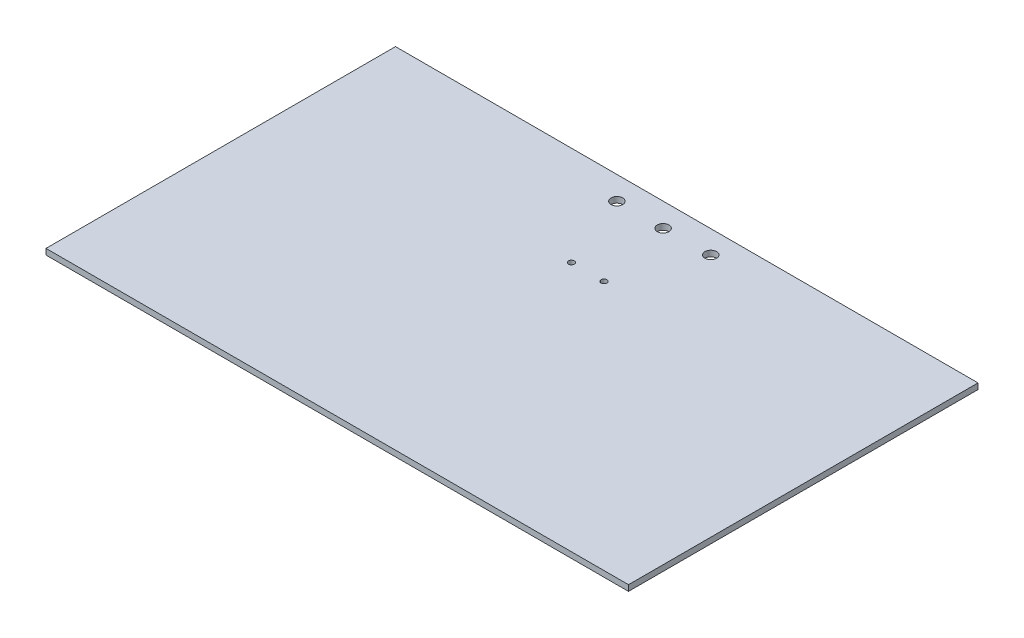
ISO-10303-21;
HEADER;
FILE_DESCRIPTION(('STEP AP214'),'2;1');
FILE_NAME('part.step','',(''),(''),'','','');
FILE_SCHEMA(('AUTOMOTIVE_DESIGN { 1 0 10303 214 1 1 1 1 }'));
ENDSEC;
DATA;
#1=APPLICATION_CONTEXT('core data for automotive mechanical design processes');
#2=APPLICATION_PROTOCOL_DEFINITION('international standard','automotive_design',2000,#1);
#3=PRODUCT_CONTEXT('',#1,'mechanical');
#4=PRODUCT('Part','Part','',(#3));
#5=PRODUCT_RELATED_PRODUCT_CATEGORY('part','',(#4));
#6=PRODUCT_DEFINITION_FORMATION('','',#4);
#7=PRODUCT_DEFINITION_CONTEXT('part definition',#1,'design');
#8=PRODUCT_DEFINITION('design','',#6,#7);
#9=PRODUCT_DEFINITION_SHAPE('','',#8);
#10=(LENGTH_UNIT() NAMED_UNIT(*) SI_UNIT(.MILLI.,.METRE.));
#11=(NAMED_UNIT(*) PLANE_ANGLE_UNIT() SI_UNIT($,.RADIAN.));
#12=(NAMED_UNIT(*) SI_UNIT($,.STERADIAN.) SOLID_ANGLE_UNIT());
#13=UNCERTAINTY_MEASURE_WITH_UNIT(LENGTH_MEASURE(1.E-05),#10,'distance_accuracy_value','');
#14=(GEOMETRIC_REPRESENTATION_CONTEXT(3) GLOBAL_UNCERTAINTY_ASSIGNED_CONTEXT((#13)) GLOBAL_UNIT_ASSIGNED_CONTEXT((#10,
#11,#12)) REPRESENTATION_CONTEXT('',''));
#15=CARTESIAN_POINT('',(0.,0.,0.));
#16=DIRECTION('',(0.,0.,1.));
#17=DIRECTION('',(1.,0.,0.));
#18=AXIS2_PLACEMENT_3D('',#15,#16,#17);
#19=CARTESIAN_POINT('',(250.,5.,-150.));
#20=DIRECTION('',(-1.,0.,0.));
#21=DIRECTION('',(0.,0.,1.));
#22=AXIS2_PLACEMENT_3D('',#19,#20,#21);
#23=PLANE('',#22);
#24=DIRECTION('',(0.,0.,-1.));
#25=VECTOR('',#24,1.);
#26=CARTESIAN_POINT('',(250.,0.,-150.));
#27=LINE('',#26,#25);
#28=CARTESIAN_POINT('',(250.,0.,150.));
#29=VERTEX_POINT('',#28);
#30=CARTESIAN_POINT('',(250.,0.,-150.));
#31=VERTEX_POINT('',#30);
#32=EDGE_CURVE('E99',#29,#31,#27,.T.);
#33=ORIENTED_EDGE('',*,*,#32,.T.);
#34=DIRECTION('',(0.,-1.,0.));
#35=VECTOR('',#34,1.);
#36=CARTESIAN_POINT('',(250.,5.,-150.));
#37=LINE('',#36,#35);
#38=CARTESIAN_POINT('',(250.,5.,-150.));
#39=VERTEX_POINT('',#38);
#40=EDGE_CURVE('E11',#39,#31,#37,.T.);
#41=ORIENTED_EDGE('',*,*,#40,.F.);
#42=DIRECTION('',(0.,0.,-1.));
#43=VECTOR('',#42,1.);
#44=CARTESIAN_POINT('',(250.,5.,-150.));
#45=LINE('',#44,#43);
#46=CARTESIAN_POINT('',(250.,5.,150.));
#47=VERTEX_POINT('',#46);
#48=EDGE_CURVE('E86',#47,#39,#45,.T.);
#49=ORIENTED_EDGE('',*,*,#48,.F.);
#50=DIRECTION('',(0.,-1.,0.));
#51=VECTOR('',#50,1.);
#52=CARTESIAN_POINT('',(250.,5.,150.));
#53=LINE('',#52,#51);
#54=EDGE_CURVE('E95',#47,#29,#53,.T.);
#55=ORIENTED_EDGE('',*,*,#54,.T.);
#56=EDGE_LOOP('',(#33,#41,#49,#55));
#57=FACE_BOUND('',#56,.T.);
#58=ADVANCED_FACE('F33',(#57),#23,.F.);
#59=CARTESIAN_POINT('',(-250.,5.,-150.));
#60=DIRECTION('',(0.,0.,1.));
#61=DIRECTION('',(1.,0.,0.));
#62=AXIS2_PLACEMENT_3D('',#59,#60,#61);
#63=PLANE('',#62);
#64=DIRECTION('',(-1.,0.,0.));
#65=VECTOR('',#64,1.);
#66=CARTESIAN_POINT('',(-250.,0.,-150.));
#67=LINE('',#66,#65);
#68=CARTESIAN_POINT('',(-250.,0.,-150.));
#69=VERTEX_POINT('',#68);
#70=EDGE_CURVE('E90',#31,#69,#67,.T.);
#71=ORIENTED_EDGE('',*,*,#70,.T.);
#72=DIRECTION('',(0.,-1.,0.));
#73=VECTOR('',#72,1.);
#74=CARTESIAN_POINT('',(-250.,5.,-150.));
#75=LINE('',#74,#73);
#76=CARTESIAN_POINT('',(-250.,5.,-150.));
#77=VERTEX_POINT('',#76);
#78=EDGE_CURVE('E42',#77,#69,#75,.T.);
#79=ORIENTED_EDGE('',*,*,#78,.F.);
#80=DIRECTION('',(-1.,0.,0.));
#81=VECTOR('',#80,1.);
#82=CARTESIAN_POINT('',(-250.,5.,-150.));
#83=LINE('',#82,#81);
#84=EDGE_CURVE('E81',#39,#77,#83,.T.);
#85=ORIENTED_EDGE('',*,*,#84,.F.);
#86=ORIENTED_EDGE('',*,*,#40,.T.);
#87=EDGE_LOOP('',(#71,#79,#85,#86));
#88=FACE_BOUND('',#87,.T.);
#89=ADVANCED_FACE('F89',(#88),#63,.F.);
#90=CARTESIAN_POINT('',(-250.,5.,-150.));
#91=DIRECTION('',(1.,0.,0.));
#92=DIRECTION('',(0.,0.,-1.));
#93=AXIS2_PLACEMENT_3D('',#90,#91,#92);
#94=PLANE('',#93);
#95=DIRECTION('',(0.,0.,1.));
#96=VECTOR('',#95,1.);
#97=CARTESIAN_POINT('',(-250.,0.,-150.));
#98=LINE('',#97,#96);
#99=CARTESIAN_POINT('',(-250.,0.,150.));
#100=VERTEX_POINT('',#99);
#101=EDGE_CURVE('E68',#69,#100,#98,.T.);
#102=ORIENTED_EDGE('',*,*,#101,.T.);
#103=DIRECTION('',(0.,-1.,0.));
#104=VECTOR('',#103,1.);
#105=CARTESIAN_POINT('',(-250.,5.,150.));
#106=LINE('',#105,#104);
#107=CARTESIAN_POINT('',(-250.,5.,150.));
#108=VERTEX_POINT('',#107);
#109=EDGE_CURVE('E91',#108,#100,#106,.T.);
#110=ORIENTED_EDGE('',*,*,#109,.F.);
#111=DIRECTION('',(0.,0.,1.));
#112=VECTOR('',#111,1.);
#113=CARTESIAN_POINT('',(-250.,5.,-150.));
#114=LINE('',#113,#112);
#115=EDGE_CURVE('E84',#77,#108,#114,.T.);
#116=ORIENTED_EDGE('',*,*,#115,.F.);
#117=ORIENTED_EDGE('',*,*,#78,.T.);
#118=EDGE_LOOP('',(#102,#110,#116,#117));
#119=FACE_BOUND('',#118,.T.);
#120=ADVANCED_FACE('F93',(#119),#94,.F.);
#121=CARTESIAN_POINT('',(-250.,5.,150.));
#122=DIRECTION('',(0.,0.,-1.));
#123=DIRECTION('',(-1.,0.,0.));
#124=AXIS2_PLACEMENT_3D('',#121,#122,#123);
#125=PLANE('',#124);
#126=DIRECTION('',(1.,0.,0.));
#127=VECTOR('',#126,1.);
#128=CARTESIAN_POINT('',(-250.,0.,150.));
#129=LINE('',#128,#127);
#130=EDGE_CURVE('E74',#100,#29,#129,.T.);
#131=ORIENTED_EDGE('',*,*,#130,.T.);
#132=ORIENTED_EDGE('',*,*,#54,.F.);
#133=DIRECTION('',(1.,0.,0.));
#134=VECTOR('',#133,1.);
#135=CARTESIAN_POINT('',(-250.,5.,150.));
#136=LINE('',#135,#134);
#137=EDGE_CURVE('E51',#108,#47,#136,.T.);
#138=ORIENTED_EDGE('',*,*,#137,.F.);
#139=ORIENTED_EDGE('',*,*,#109,.T.);
#140=EDGE_LOOP('',(#131,#132,#138,#139));
#141=FACE_BOUND('',#140,.T.);
#142=ADVANCED_FACE('F151',(#141),#125,.F.);
#143=CARTESIAN_POINT('',(0.,5.,0.));
#144=DIRECTION('',(0.,1.,0.));
#145=DIRECTION('',(0.,0.,1.));
#146=AXIS2_PLACEMENT_3D('',#143,#144,#145);
#147=PLANE('',#146);
#148=CARTESIAN_POINT('',(13.9999999999995,5.,-65.0000000000002));
#149=DIRECTION('',(0.,1.,0.));
#150=DIRECTION('',(0.,0.,1.));
#151=AXIS2_PLACEMENT_3D('',#148,#149,#150);
#152=CIRCLE('',#151,2.5);
#153=CARTESIAN_POINT('',(13.9999999999995,5.,-62.5000000000002));
#154=VERTEX_POINT('',#153);
#155=EDGE_CURVE('E133',#154,#154,#152,.T.);
#156=ORIENTED_EDGE('',*,*,#155,.F.);
#157=EDGE_LOOP('',(#156));
#158=FACE_BOUND('',#157,.T.);
#159=CARTESIAN_POINT('',(-14.0000000000005,5.,-65.0000000000002));
#160=DIRECTION('',(0.,1.,0.));
#161=DIRECTION('',(0.,0.,1.));
#162=AXIS2_PLACEMENT_3D('',#159,#160,#161);
#163=CIRCLE('',#162,2.5);
#164=CARTESIAN_POINT('',(-14.0000000000005,5.,-62.5000000000002));
#165=VERTEX_POINT('',#164);
#166=EDGE_CURVE('E127',#165,#165,#163,.T.);
#167=ORIENTED_EDGE('',*,*,#166,.F.);
#168=EDGE_LOOP('',(#167));
#169=FACE_BOUND('',#168,.T.);
#170=CARTESIAN_POINT('',(40.1963517584179,5.,-130.448547007561));
#171=DIRECTION('',(0.,1.,0.));
#172=DIRECTION('',(0.,0.,1.));
#173=AXIS2_PLACEMENT_3D('',#170,#171,#172);
#174=CIRCLE('',#173,5.);
#175=CARTESIAN_POINT('',(40.1963517584179,5.,-125.448547007561));
#176=VERTEX_POINT('',#175);
#177=EDGE_CURVE('E118',#176,#176,#174,.T.);
#178=ORIENTED_EDGE('',*,*,#177,.F.);
#179=EDGE_LOOP('',(#178));
#180=FACE_BOUND('',#179,.T.);
#181=CARTESIAN_POINT('',(-40.0442499332889,5.,-130.077128907284));
#182=DIRECTION('',(0.,-1.,0.));
#183=DIRECTION('',(0.,0.,-1.));
#184=AXIS2_PLACEMENT_3D('',#181,#182,#183);
#185=CIRCLE('',#184,5.);
#186=CARTESIAN_POINT('',(-40.0442499332889,5.,-135.077128907284));
#187=VERTEX_POINT('',#186);
#188=EDGE_CURVE('E108',#187,#187,#185,.T.);
#189=ORIENTED_EDGE('',*,*,#188,.T.);
#190=EDGE_LOOP('',(#189));
#191=FACE_BOUND('',#190,.T.);
#192=CARTESIAN_POINT('',(-0.0713866527419227,5.,-129.777985414123));
#193=DIRECTION('',(0.,-1.,0.));
#194=DIRECTION('',(0.,0.,-1.));
#195=AXIS2_PLACEMENT_3D('',#192,#193,#194);
#196=CIRCLE('',#195,5.00000000000001);
#197=CARTESIAN_POINT('',(-0.0713866527419227,5.,-134.777985414123));
#198=VERTEX_POINT('',#197);
#199=EDGE_CURVE('E113',#198,#198,#196,.T.);
#200=ORIENTED_EDGE('',*,*,#199,.T.);
#201=EDGE_LOOP('',(#200));
#202=FACE_BOUND('',#201,.T.);
#203=ORIENTED_EDGE('',*,*,#48,.T.);
#204=ORIENTED_EDGE('',*,*,#84,.T.);
#205=ORIENTED_EDGE('',*,*,#115,.T.);
#206=ORIENTED_EDGE('',*,*,#137,.T.);
#207=EDGE_LOOP('',(#203,#204,#205,#206));
#208=FACE_BOUND('',#207,.T.);
#209=ADVANCED_FACE('F82',(#158,#169,#180,#191,#202,#208),#147,.T.);
#210=CARTESIAN_POINT('',(0.,0.,0.));
#211=DIRECTION('',(0.,1.,0.));
#212=DIRECTION('',(0.,0.,1.));
#213=AXIS2_PLACEMENT_3D('',#210,#211,#212);
#214=PLANE('',#213);
#215=CARTESIAN_POINT('',(13.9999999999995,0.,-65.0000000000002));
#216=DIRECTION('',(0.,1.,0.));
#217=DIRECTION('',(0.,0.,1.));
#218=AXIS2_PLACEMENT_3D('',#215,#216,#217);
#219=CIRCLE('',#218,2.5);
#220=CARTESIAN_POINT('',(13.9999999999995,0.,-62.5000000000002));
#221=VERTEX_POINT('',#220);
#222=EDGE_CURVE('E126',#221,#221,#219,.T.);
#223=ORIENTED_EDGE('',*,*,#222,.T.);
#224=EDGE_LOOP('',(#223));
#225=FACE_BOUND('',#224,.T.);
#226=CARTESIAN_POINT('',(-14.0000000000005,0.,-65.0000000000002));
#227=DIRECTION('',(0.,1.,0.));
#228=DIRECTION('',(0.,0.,1.));
#229=AXIS2_PLACEMENT_3D('',#226,#227,#228);
#230=CIRCLE('',#229,2.5);
#231=CARTESIAN_POINT('',(-14.0000000000005,0.,-62.5000000000002));
#232=VERTEX_POINT('',#231);
#233=EDGE_CURVE('E130',#232,#232,#230,.T.);
#234=ORIENTED_EDGE('',*,*,#233,.T.);
#235=EDGE_LOOP('',(#234));
#236=FACE_BOUND('',#235,.T.);
#237=CARTESIAN_POINT('',(40.1963517584179,0.,-130.448547007561));
#238=DIRECTION('',(0.,1.,0.));
#239=DIRECTION('',(0.,0.,1.));
#240=AXIS2_PLACEMENT_3D('',#237,#238,#239);
#241=CIRCLE('',#240,5.);
#242=CARTESIAN_POINT('',(40.1963517584179,0.,-125.448547007561));
#243=VERTEX_POINT('',#242);
#244=EDGE_CURVE('E123',#243,#243,#241,.T.);
#245=ORIENTED_EDGE('',*,*,#244,.T.);
#246=EDGE_LOOP('',(#245));
#247=FACE_BOUND('',#246,.T.);
#248=CARTESIAN_POINT('',(-40.0442499332889,0.,-130.077128907284));
#249=DIRECTION('',(0.,1.,0.));
#250=DIRECTION('',(0.,0.,1.));
#251=AXIS2_PLACEMENT_3D('',#248,#249,#250);
#252=CIRCLE('',#251,5.);
#253=CARTESIAN_POINT('',(-40.0442499332889,0.,-125.077128907284));
#254=VERTEX_POINT('',#253);
#255=EDGE_CURVE('E36',#254,#254,#252,.T.);
#256=ORIENTED_EDGE('',*,*,#255,.T.);
#257=EDGE_LOOP('',(#256));
#258=FACE_BOUND('',#257,.T.);
#259=CARTESIAN_POINT('',(-0.0713866527419227,0.,-129.777985414123));
#260=DIRECTION('',(0.,1.,0.));
#261=DIRECTION('',(0.,0.,1.));
#262=AXIS2_PLACEMENT_3D('',#259,#260,#261);
#263=CIRCLE('',#262,5.00000000000001);
#264=CARTESIAN_POINT('',(-0.0713866527419227,0.,-124.777985414123));
#265=VERTEX_POINT('',#264);
#266=EDGE_CURVE('E106',#265,#265,#263,.T.);
#267=ORIENTED_EDGE('',*,*,#266,.T.);
#268=EDGE_LOOP('',(#267));
#269=FACE_BOUND('',#268,.T.);
#270=ORIENTED_EDGE('',*,*,#32,.F.);
#271=ORIENTED_EDGE('',*,*,#130,.F.);
#272=ORIENTED_EDGE('',*,*,#101,.F.);
#273=ORIENTED_EDGE('',*,*,#70,.F.);
#274=EDGE_LOOP('',(#270,#271,#272,#273));
#275=FACE_BOUND('',#274,.T.);
#276=ADVANCED_FACE('F139',(#225,#236,#247,#258,#269,#275),#214,.F.);
#277=CARTESIAN_POINT('',(-0.0713866527419227,5.,-129.777985414123));
#278=DIRECTION('',(0.,-1.,0.));
#279=DIRECTION('',(0.,0.,-1.));
#280=AXIS2_PLACEMENT_3D('',#277,#278,#279);
#281=CYLINDRICAL_SURFACE('',#280,5.00000000000001);
#282=ORIENTED_EDGE('',*,*,#199,.F.);
#283=EDGE_LOOP('',(#282));
#284=FACE_BOUND('',#283,.T.);
#285=ORIENTED_EDGE('',*,*,#266,.F.);
#286=EDGE_LOOP('',(#285));
#287=FACE_BOUND('',#286,.T.);
#288=ADVANCED_FACE('F159',(#284,#287),#281,.F.);
#289=CARTESIAN_POINT('',(-40.0442499332889,5.,-130.077128907284));
#290=DIRECTION('',(0.,-1.,0.));
#291=DIRECTION('',(0.,0.,-1.));
#292=AXIS2_PLACEMENT_3D('',#289,#290,#291);
#293=CYLINDRICAL_SURFACE('',#292,5.);
#294=ORIENTED_EDGE('',*,*,#188,.F.);
#295=EDGE_LOOP('',(#294));
#296=FACE_BOUND('',#295,.T.);
#297=ORIENTED_EDGE('',*,*,#255,.F.);
#298=EDGE_LOOP('',(#297));
#299=FACE_BOUND('',#298,.T.);
#300=ADVANCED_FACE('F162',(#296,#299),#293,.F.);
#301=CARTESIAN_POINT('',(40.1963517584179,0.,-130.448547007561));
#302=DIRECTION('',(0.,1.,0.));
#303=DIRECTION('',(0.,0.,1.));
#304=AXIS2_PLACEMENT_3D('',#301,#302,#303);
#305=CYLINDRICAL_SURFACE('',#304,5.);
#306=ORIENTED_EDGE('',*,*,#177,.T.);
#307=EDGE_LOOP('',(#306));
#308=FACE_BOUND('',#307,.T.);
#309=ORIENTED_EDGE('',*,*,#244,.F.);
#310=EDGE_LOOP('',(#309));
#311=FACE_BOUND('',#310,.T.);
#312=ADVANCED_FACE('F168',(#308,#311),#305,.F.);
#313=CARTESIAN_POINT('',(-14.0000000000005,0.,-65.0000000000002));
#314=DIRECTION('',(0.,1.,0.));
#315=DIRECTION('',(0.,0.,1.));
#316=AXIS2_PLACEMENT_3D('',#313,#314,#315);
#317=CYLINDRICAL_SURFACE('',#316,2.5);
#318=ORIENTED_EDGE('',*,*,#233,.F.);
#319=EDGE_LOOP('',(#318));
#320=FACE_BOUND('',#319,.T.);
#321=ORIENTED_EDGE('',*,*,#166,.T.);
#322=EDGE_LOOP('',(#321));
#323=FACE_BOUND('',#322,.T.);
#324=ADVANCED_FACE('F145',(#320,#323),#317,.F.);
#325=CARTESIAN_POINT('',(13.9999999999995,0.,-65.0000000000002));
#326=DIRECTION('',(0.,1.,0.));
#327=DIRECTION('',(0.,0.,1.));
#328=AXIS2_PLACEMENT_3D('',#325,#326,#327);
#329=CYLINDRICAL_SURFACE('',#328,2.5);
#330=ORIENTED_EDGE('',*,*,#222,.F.);
#331=EDGE_LOOP('',(#330));
#332=FACE_BOUND('',#331,.T.);
#333=ORIENTED_EDGE('',*,*,#155,.T.);
#334=EDGE_LOOP('',(#333));
#335=FACE_BOUND('',#334,.T.);
#336=ADVANCED_FACE('F142',(#332,#335),#329,.F.);
#337=CLOSED_SHELL('',(#58,#89,#120,#142,#209,#276,#288,#300,#312,#324,#336));
#338=MANIFOLD_SOLID_BREP('B2',#337);
#339=ADVANCED_BREP_SHAPE_REPRESENTATION('',(#18,#338),#14);
#340=SHAPE_DEFINITION_REPRESENTATION(#9,#339);
ENDSEC;
END-ISO-10303-21;
